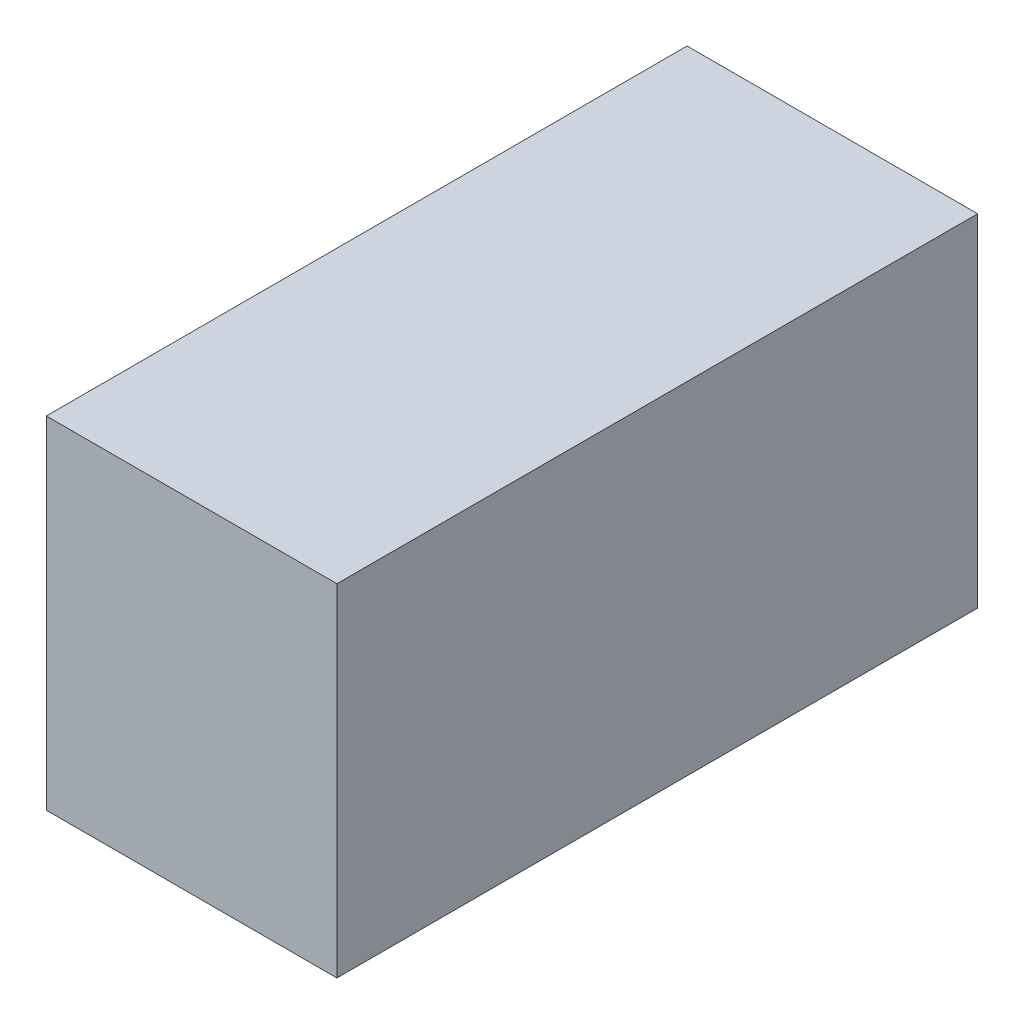
ISO-10303-21;
HEADER;
FILE_DESCRIPTION(('STEP AP214'),'2;1');
FILE_NAME('part.step','',(''),(''),'','','');
FILE_SCHEMA(('AUTOMOTIVE_DESIGN { 1 0 10303 214 1 1 1 1 }'));
ENDSEC;
DATA;
#1=APPLICATION_CONTEXT('core data for automotive mechanical design processes');
#2=APPLICATION_PROTOCOL_DEFINITION('international standard','automotive_design',2000,#1);
#3=PRODUCT_CONTEXT('',#1,'mechanical');
#4=PRODUCT('Part','Part','',(#3));
#5=PRODUCT_RELATED_PRODUCT_CATEGORY('part','',(#4));
#6=PRODUCT_DEFINITION_FORMATION('','',#4);
#7=PRODUCT_DEFINITION_CONTEXT('part definition',#1,'design');
#8=PRODUCT_DEFINITION('design','',#6,#7);
#9=PRODUCT_DEFINITION_SHAPE('','',#8);
#10=(LENGTH_UNIT() NAMED_UNIT(*) SI_UNIT(.MILLI.,.METRE.));
#11=(NAMED_UNIT(*) PLANE_ANGLE_UNIT() SI_UNIT($,.RADIAN.));
#12=(NAMED_UNIT(*) SI_UNIT($,.STERADIAN.) SOLID_ANGLE_UNIT());
#13=UNCERTAINTY_MEASURE_WITH_UNIT(LENGTH_MEASURE(1.E-05),#10,'distance_accuracy_value','');
#14=(GEOMETRIC_REPRESENTATION_CONTEXT(3) GLOBAL_UNCERTAINTY_ASSIGNED_CONTEXT((#13)) GLOBAL_UNIT_ASSIGNED_CONTEXT((#10,
#11,#12)) REPRESENTATION_CONTEXT('',''));
#15=CARTESIAN_POINT('',(0.,0.,0.));
#16=DIRECTION('',(0.,0.,1.));
#17=DIRECTION('',(1.,0.,0.));
#18=AXIS2_PLACEMENT_3D('',#15,#16,#17);
#19=CARTESIAN_POINT('',(10.,-11.75,44.1));
#20=DIRECTION('',(-1.,0.,0.));
#21=DIRECTION('',(0.,0.,1.));
#22=AXIS2_PLACEMENT_3D('',#19,#20,#21);
#23=PLANE('',#22);
#24=DIRECTION('',(0.,1.,0.));
#25=VECTOR('',#24,1.);
#26=CARTESIAN_POINT('',(10.,-11.75,0.));
#27=LINE('',#26,#25);
#28=CARTESIAN_POINT('',(10.,-11.75,0.));
#29=VERTEX_POINT('',#28);
#30=CARTESIAN_POINT('',(10.,11.75,0.));
#31=VERTEX_POINT('',#30);
#32=EDGE_CURVE('E102',#29,#31,#27,.T.);
#33=ORIENTED_EDGE('',*,*,#32,.T.);
#34=DIRECTION('',(0.,0.,-1.));
#35=VECTOR('',#34,1.);
#36=CARTESIAN_POINT('',(10.,11.75,44.1));
#37=LINE('',#36,#35);
#38=CARTESIAN_POINT('',(10.,11.75,44.1));
#39=VERTEX_POINT('',#38);
#40=EDGE_CURVE('E11',#39,#31,#37,.T.);
#41=ORIENTED_EDGE('',*,*,#40,.F.);
#42=DIRECTION('',(0.,1.,0.));
#43=VECTOR('',#42,1.);
#44=CARTESIAN_POINT('',(10.,-11.75,44.1));
#45=LINE('',#44,#43);
#46=CARTESIAN_POINT('',(10.,-11.75,44.1));
#47=VERTEX_POINT('',#46);
#48=EDGE_CURVE('E90',#47,#39,#45,.T.);
#49=ORIENTED_EDGE('',*,*,#48,.F.);
#50=DIRECTION('',(0.,0.,-1.));
#51=VECTOR('',#50,1.);
#52=CARTESIAN_POINT('',(10.,-11.75,44.1));
#53=LINE('',#52,#51);
#54=EDGE_CURVE('E98',#47,#29,#53,.T.);
#55=ORIENTED_EDGE('',*,*,#54,.T.);
#56=EDGE_LOOP('',(#33,#41,#49,#55));
#57=FACE_BOUND('',#56,.T.);
#58=ADVANCED_FACE('F39',(#57),#23,.F.);
#59=CARTESIAN_POINT('',(-10.,11.75,44.1));
#60=DIRECTION('',(0.,-1.,0.));
#61=DIRECTION('',(0.,0.,-1.));
#62=AXIS2_PLACEMENT_3D('',#59,#60,#61);
#63=PLANE('',#62);
#64=DIRECTION('',(-1.,0.,0.));
#65=VECTOR('',#64,1.);
#66=CARTESIAN_POINT('',(-10.,11.75,0.));
#67=LINE('',#66,#65);
#68=CARTESIAN_POINT('',(-10.,11.75,0.));
#69=VERTEX_POINT('',#68);
#70=EDGE_CURVE('E94',#31,#69,#67,.T.);
#71=ORIENTED_EDGE('',*,*,#70,.T.);
#72=DIRECTION('',(0.,0.,-1.));
#73=VECTOR('',#72,1.);
#74=CARTESIAN_POINT('',(-10.,11.75,44.1));
#75=LINE('',#74,#73);
#76=CARTESIAN_POINT('',(-10.,11.75,44.1));
#77=VERTEX_POINT('',#76);
#78=EDGE_CURVE('E47',#77,#69,#75,.T.);
#79=ORIENTED_EDGE('',*,*,#78,.F.);
#80=DIRECTION('',(-1.,0.,0.));
#81=VECTOR('',#80,1.);
#82=CARTESIAN_POINT('',(-10.,11.75,44.1));
#83=LINE('',#82,#81);
#84=EDGE_CURVE('E85',#39,#77,#83,.T.);
#85=ORIENTED_EDGE('',*,*,#84,.F.);
#86=ORIENTED_EDGE('',*,*,#40,.T.);
#87=EDGE_LOOP('',(#71,#79,#85,#86));
#88=FACE_BOUND('',#87,.T.);
#89=ADVANCED_FACE('F93',(#88),#63,.F.);
#90=CARTESIAN_POINT('',(-10.,-11.75,44.1));
#91=DIRECTION('',(1.,0.,0.));
#92=DIRECTION('',(0.,0.,-1.));
#93=AXIS2_PLACEMENT_3D('',#90,#91,#92);
#94=PLANE('',#93);
#95=DIRECTION('',(0.,-1.,0.));
#96=VECTOR('',#95,1.);
#97=CARTESIAN_POINT('',(-10.,-11.75,0.));
#98=LINE('',#97,#96);
#99=CARTESIAN_POINT('',(-10.,-11.75,0.));
#100=VERTEX_POINT('',#99);
#101=EDGE_CURVE('E72',#69,#100,#98,.T.);
#102=ORIENTED_EDGE('',*,*,#101,.T.);
#103=DIRECTION('',(0.,0.,-1.));
#104=VECTOR('',#103,1.);
#105=CARTESIAN_POINT('',(-10.,-11.75,44.1));
#106=LINE('',#105,#104);
#107=CARTESIAN_POINT('',(-10.,-11.75,44.1));
#108=VERTEX_POINT('',#107);
#109=EDGE_CURVE('E95',#108,#100,#106,.T.);
#110=ORIENTED_EDGE('',*,*,#109,.F.);
#111=DIRECTION('',(0.,-1.,0.));
#112=VECTOR('',#111,1.);
#113=CARTESIAN_POINT('',(-10.,-11.75,44.1));
#114=LINE('',#113,#112);
#115=EDGE_CURVE('E88',#77,#108,#114,.T.);
#116=ORIENTED_EDGE('',*,*,#115,.F.);
#117=ORIENTED_EDGE('',*,*,#78,.T.);
#118=EDGE_LOOP('',(#102,#110,#116,#117));
#119=FACE_BOUND('',#118,.T.);
#120=ADVANCED_FACE('F96',(#119),#94,.F.);
#121=CARTESIAN_POINT('',(-10.,-11.75,44.1));
#122=DIRECTION('',(0.,1.,0.));
#123=DIRECTION('',(0.,0.,1.));
#124=AXIS2_PLACEMENT_3D('',#121,#122,#123);
#125=PLANE('',#124);
#126=DIRECTION('',(1.,0.,0.));
#127=VECTOR('',#126,1.);
#128=CARTESIAN_POINT('',(-10.,-11.75,0.));
#129=LINE('',#128,#127);
#130=EDGE_CURVE('E78',#100,#29,#129,.T.);
#131=ORIENTED_EDGE('',*,*,#130,.T.);
#132=ORIENTED_EDGE('',*,*,#54,.F.);
#133=DIRECTION('',(1.,0.,0.));
#134=VECTOR('',#133,1.);
#135=CARTESIAN_POINT('',(-10.,-11.75,44.1));
#136=LINE('',#135,#134);
#137=EDGE_CURVE('E55',#108,#47,#136,.T.);
#138=ORIENTED_EDGE('',*,*,#137,.F.);
#139=ORIENTED_EDGE('',*,*,#109,.T.);
#140=EDGE_LOOP('',(#131,#132,#138,#139));
#141=FACE_BOUND('',#140,.T.);
#142=ADVANCED_FACE('F109',(#141),#125,.F.);
#143=CARTESIAN_POINT('',(0.,0.,44.1));
#144=DIRECTION('',(0.,0.,-1.));
#145=DIRECTION('',(-1.,0.,0.));
#146=AXIS2_PLACEMENT_3D('',#143,#144,#145);
#147=PLANE('',#146);
#148=ORIENTED_EDGE('',*,*,#48,.T.);
#149=ORIENTED_EDGE('',*,*,#84,.T.);
#150=ORIENTED_EDGE('',*,*,#115,.T.);
#151=ORIENTED_EDGE('',*,*,#137,.T.);
#152=EDGE_LOOP('',(#148,#149,#150,#151));
#153=FACE_BOUND('',#152,.T.);
#154=ADVANCED_FACE('F86',(#153),#147,.F.);
#155=CARTESIAN_POINT('',(0.,0.,0.));
#156=DIRECTION('',(0.,0.,-1.));
#157=DIRECTION('',(-1.,0.,0.));
#158=AXIS2_PLACEMENT_3D('',#155,#156,#157);
#159=PLANE('',#158);
#160=ORIENTED_EDGE('',*,*,#32,.F.);
#161=ORIENTED_EDGE('',*,*,#130,.F.);
#162=ORIENTED_EDGE('',*,*,#101,.F.);
#163=ORIENTED_EDGE('',*,*,#70,.F.);
#164=EDGE_LOOP('',(#160,#161,#162,#163));
#165=FACE_BOUND('',#164,.T.);
#166=ADVANCED_FACE('F112',(#165),#159,.T.);
#167=CLOSED_SHELL('',(#58,#89,#120,#142,#154,#166));
#168=MANIFOLD_SOLID_BREP('B2',#167);
#169=ADVANCED_BREP_SHAPE_REPRESENTATION('',(#18,#168),#14);
#170=SHAPE_DEFINITION_REPRESENTATION(#9,#169);
ENDSEC;
END-ISO-10303-21;
